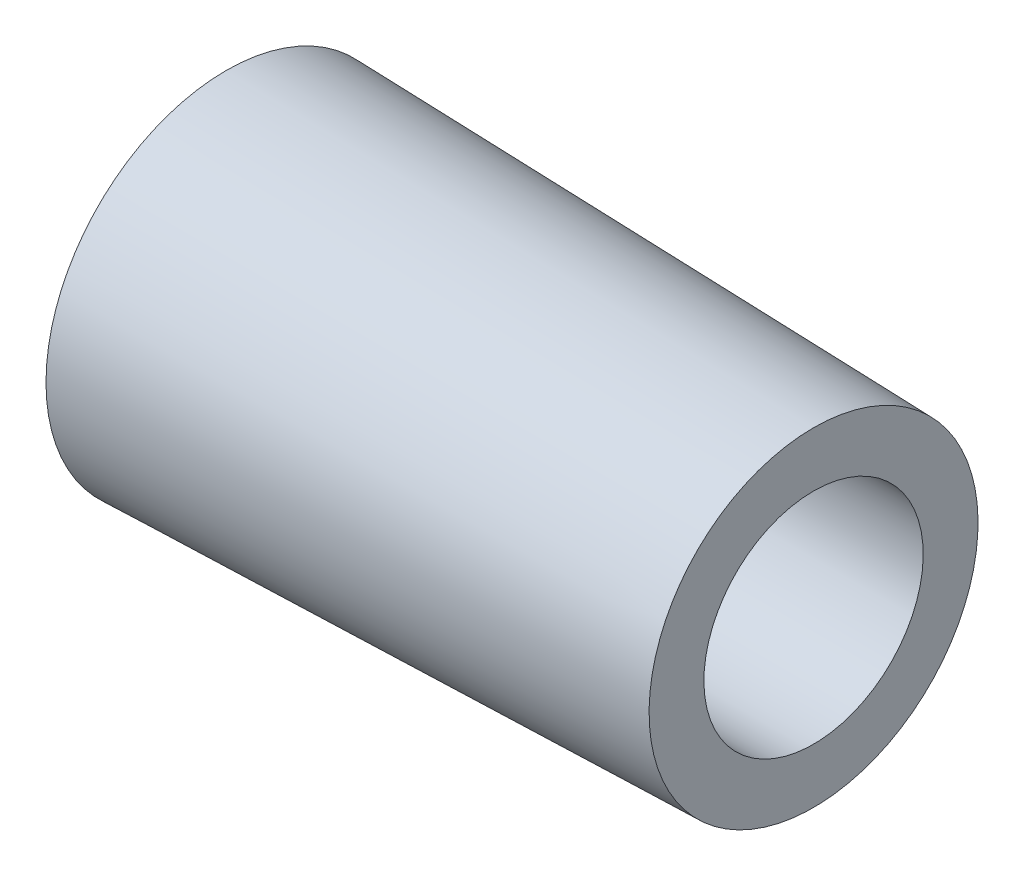
ISO-10303-21;
HEADER;
FILE_DESCRIPTION(('STEP AP214'),'2;1');
FILE_NAME('part.step','',(''),(''),'','','');
FILE_SCHEMA(('AUTOMOTIVE_DESIGN { 1 0 10303 214 1 1 1 1 }'));
ENDSEC;
DATA;
#1=APPLICATION_CONTEXT('core data for automotive mechanical design processes');
#2=APPLICATION_PROTOCOL_DEFINITION('international standard','automotive_design',2000,#1);
#3=PRODUCT_CONTEXT('',#1,'mechanical');
#4=PRODUCT('Part','Part','',(#3));
#5=PRODUCT_RELATED_PRODUCT_CATEGORY('part','',(#4));
#6=PRODUCT_DEFINITION_FORMATION('','',#4);
#7=PRODUCT_DEFINITION_CONTEXT('part definition',#1,'design');
#8=PRODUCT_DEFINITION('design','',#6,#7);
#9=PRODUCT_DEFINITION_SHAPE('','',#8);
#10=(LENGTH_UNIT() NAMED_UNIT(*) SI_UNIT(.MILLI.,.METRE.));
#11=(NAMED_UNIT(*) PLANE_ANGLE_UNIT() SI_UNIT($,.RADIAN.));
#12=(NAMED_UNIT(*) SI_UNIT($,.STERADIAN.) SOLID_ANGLE_UNIT());
#13=UNCERTAINTY_MEASURE_WITH_UNIT(LENGTH_MEASURE(1.E-05),#10,'distance_accuracy_value','');
#14=(GEOMETRIC_REPRESENTATION_CONTEXT(3) GLOBAL_UNCERTAINTY_ASSIGNED_CONTEXT((#13)) GLOBAL_UNIT_ASSIGNED_CONTEXT((#10,
#11,#12)) REPRESENTATION_CONTEXT('',''));
#15=CARTESIAN_POINT('',(0.,0.,0.));
#16=DIRECTION('',(0.,0.,1.));
#17=DIRECTION('',(1.,0.,0.));
#18=AXIS2_PLACEMENT_3D('',#15,#16,#17);
#19=CARTESIAN_POINT('',(0.,0.,0.));
#20=DIRECTION('',(-1.,0.,0.));
#21=DIRECTION('',(0.,0.,1.));
#22=AXIS2_PLACEMENT_3D('',#19,#20,#21);
#23=CYLINDRICAL_SURFACE('',#22,280.);
#24=CARTESIAN_POINT('',(1900.,0.,0.));
#25=DIRECTION('',(-1.,0.,0.));
#26=DIRECTION('',(0.,0.,1.));
#27=AXIS2_PLACEMENT_3D('',#24,#25,#26);
#28=CIRCLE('',#27,280.);
#29=CARTESIAN_POINT('',(1900.,280.,-2.0102840967113E-06));
#30=VERTEX_POINT('',#29);
#31=CARTESIAN_POINT('',(1900.,280.,0.));
#32=VERTEX_POINT('',#31);
#33=EDGE_CURVE('E11',#30,#32,#28,.T.);
#34=ORIENTED_EDGE('',*,*,#33,.T.);
#35=DIRECTION('',(1.,0.,0.));
#36=VECTOR('',#35,1.);
#37=CARTESIAN_POINT('',(3400.,280.,0.));
#38=LINE('',#37,#36);
#39=CARTESIAN_POINT('',(3400.,280.,0.));
#40=VERTEX_POINT('',#39);
#41=EDGE_CURVE('E100',#32,#40,#38,.T.);
#42=ORIENTED_EDGE('',*,*,#41,.T.);
#43=CARTESIAN_POINT('',(3400.,0.,0.));
#44=DIRECTION('',(-1.,0.,0.));
#45=DIRECTION('',(0.,0.,1.));
#46=AXIS2_PLACEMENT_3D('',#43,#44,#45);
#47=CIRCLE('',#46,280.);
#48=CARTESIAN_POINT('',(3400.,280.,-2.0102840967113E-06));
#49=VERTEX_POINT('',#48);
#50=EDGE_CURVE('E80',#49,#40,#47,.T.);
#51=ORIENTED_EDGE('',*,*,#50,.F.);
#52=DIRECTION('',(1.,0.,0.));
#53=VECTOR('',#52,1.);
#54=CARTESIAN_POINT('',(3400.,280.,-2.0102840967113E-06));
#55=LINE('',#54,#53);
#56=EDGE_CURVE('E103',#30,#49,#55,.T.);
#57=ORIENTED_EDGE('',*,*,#56,.F.);
#58=EDGE_LOOP('',(#34,#42,#51,#57));
#59=FACE_BOUND('',#58,.T.);
#60=ADVANCED_FACE('F39',(#59),#23,.F.);
#61=CARTESIAN_POINT('',(1900.,280.,-2.0102840967113E-06));
#62=DIRECTION('',(1.,0.,0.));
#63=DIRECTION('',(0.,0.,-1.));
#64=AXIS2_PLACEMENT_3D('',#61,#62,#63);
#65=PLANE('',#64);
#66=CARTESIAN_POINT('',(1900.,0.,0.));
#67=DIRECTION('',(-1.,0.,0.));
#68=DIRECTION('',(0.,0.,1.));
#69=AXIS2_PLACEMENT_3D('',#66,#67,#68);
#70=CIRCLE('',#69,460.);
#71=CARTESIAN_POINT('',(1900.,460.,-3.30260958745428E-06));
#72=VERTEX_POINT('',#71);
#73=CARTESIAN_POINT('',(1900.,460.,0.));
#74=VERTEX_POINT('',#73);
#75=EDGE_CURVE('E50',#72,#74,#70,.T.);
#76=ORIENTED_EDGE('',*,*,#75,.T.);
#77=DIRECTION('',(0.,-1.,0.));
#78=VECTOR('',#77,1.);
#79=CARTESIAN_POINT('',(1900.,280.,0.));
#80=LINE('',#79,#78);
#81=EDGE_CURVE('E104',#74,#32,#80,.T.);
#82=ORIENTED_EDGE('',*,*,#81,.T.);
#83=ORIENTED_EDGE('',*,*,#33,.F.);
#84=DIRECTION('',(0.,-1.,7.17958605968322E-09));
#85=VECTOR('',#84,1.);
#86=CARTESIAN_POINT('',(1900.,280.,-2.0102840967113E-06));
#87=LINE('',#86,#85);
#88=EDGE_CURVE('E91',#72,#30,#87,.T.);
#89=ORIENTED_EDGE('',*,*,#88,.F.);
#90=EDGE_LOOP('',(#76,#82,#83,#89));
#91=FACE_BOUND('',#90,.T.);
#92=ADVANCED_FACE('F41',(#91),#65,.F.);
#93=CARTESIAN_POINT('',(3400.,0.,0.));
#94=DIRECTION('',(-1.,0.,0.));
#95=DIRECTION('',(0.,0.,1.));
#96=AXIS2_PLACEMENT_3D('',#93,#94,#95);
#97=CONICAL_SURFACE('',#96,420.,0.026660348374598);
#98=CARTESIAN_POINT('',(3400.,0.,0.));
#99=DIRECTION('',(-1.,0.,0.));
#100=DIRECTION('',(0.,0.,1.));
#101=AXIS2_PLACEMENT_3D('',#98,#99,#100);
#102=CIRCLE('',#101,420.);
#103=CARTESIAN_POINT('',(3400.,420.,-3.01542614506695E-06));
#104=VERTEX_POINT('',#103);
#105=CARTESIAN_POINT('',(3400.,420.,0.));
#106=VERTEX_POINT('',#105);
#107=EDGE_CURVE('E89',#104,#106,#102,.T.);
#108=ORIENTED_EDGE('',*,*,#107,.T.);
#109=DIRECTION('',(-0.999644633961771,0.0266571902389806,0.));
#110=VECTOR('',#109,1.);
#111=CARTESIAN_POINT('',(1900.,460.,0.));
#112=LINE('',#111,#110);
#113=EDGE_CURVE('E97',#106,#74,#112,.T.);
#114=ORIENTED_EDGE('',*,*,#113,.T.);
#115=ORIENTED_EDGE('',*,*,#75,.F.);
#116=DIRECTION('',(-0.999644633961771,0.0266571902389806,-1.91387591430109E-10));
#117=VECTOR('',#116,1.);
#118=CARTESIAN_POINT('',(1900.,460.,-3.30260958745428E-06));
#119=LINE('',#118,#117);
#120=EDGE_CURVE('E109',#104,#72,#119,.T.);
#121=ORIENTED_EDGE('',*,*,#120,.F.);
#122=EDGE_LOOP('',(#108,#114,#115,#121));
#123=FACE_BOUND('',#122,.T.);
#124=ADVANCED_FACE('F112',(#123),#97,.T.);
#125=CARTESIAN_POINT('',(3400.,420.,-3.01542614506695E-06));
#126=DIRECTION('',(-1.,0.,0.));
#127=DIRECTION('',(0.,0.,1.));
#128=AXIS2_PLACEMENT_3D('',#125,#126,#127);
#129=PLANE('',#128);
#130=DIRECTION('',(0.,1.,-7.17958605968322E-09));
#131=VECTOR('',#130,1.);
#132=CARTESIAN_POINT('',(3400.,420.,-3.01542614506695E-06));
#133=LINE('',#132,#131);
#134=EDGE_CURVE('E82',#49,#104,#133,.T.);
#135=ORIENTED_EDGE('',*,*,#134,.F.);
#136=ORIENTED_EDGE('',*,*,#50,.T.);
#137=DIRECTION('',(0.,1.,0.));
#138=VECTOR('',#137,1.);
#139=CARTESIAN_POINT('',(3400.,420.,0.));
#140=LINE('',#139,#138);
#141=EDGE_CURVE('E85',#40,#106,#140,.T.);
#142=ORIENTED_EDGE('',*,*,#141,.T.);
#143=ORIENTED_EDGE('',*,*,#107,.F.);
#144=EDGE_LOOP('',(#135,#136,#142,#143));
#145=FACE_BOUND('',#144,.T.);
#146=ADVANCED_FACE('F83',(#145),#129,.F.);
#147=CARTESIAN_POINT('',(0.,0.,0.));
#148=DIRECTION('',(0.,-7.17958605968322E-09,-1.));
#149=DIRECTION('',(-1.,0.,0.));
#150=AXIS2_PLACEMENT_3D('',#147,#148,#149);
#151=PLANE('',#150);
#152=ORIENTED_EDGE('',*,*,#56,.T.);
#153=ORIENTED_EDGE('',*,*,#134,.T.);
#154=ORIENTED_EDGE('',*,*,#120,.T.);
#155=ORIENTED_EDGE('',*,*,#88,.T.);
#156=EDGE_LOOP('',(#152,#153,#154,#155));
#157=FACE_BOUND('',#156,.T.);
#158=ADVANCED_FACE('F111',(#157),#151,.F.);
#159=CARTESIAN_POINT('',(0.,0.,0.));
#160=DIRECTION('',(0.,0.,-1.));
#161=DIRECTION('',(-1.,0.,0.));
#162=AXIS2_PLACEMENT_3D('',#159,#160,#161);
#163=PLANE('',#162);
#164=ORIENTED_EDGE('',*,*,#41,.F.);
#165=ORIENTED_EDGE('',*,*,#81,.F.);
#166=ORIENTED_EDGE('',*,*,#113,.F.);
#167=ORIENTED_EDGE('',*,*,#141,.F.);
#168=EDGE_LOOP('',(#164,#165,#166,#167));
#169=FACE_BOUND('',#168,.T.);
#170=ADVANCED_FACE('F94',(#169),#163,.T.);
#171=CLOSED_SHELL('',(#60,#92,#124,#146,#158,#170));
#172=MANIFOLD_SOLID_BREP('B2',#171);
#173=ADVANCED_BREP_SHAPE_REPRESENTATION('',(#18,#172),#14);
#174=SHAPE_DEFINITION_REPRESENTATION(#9,#173);
ENDSEC;
END-ISO-10303-21;
